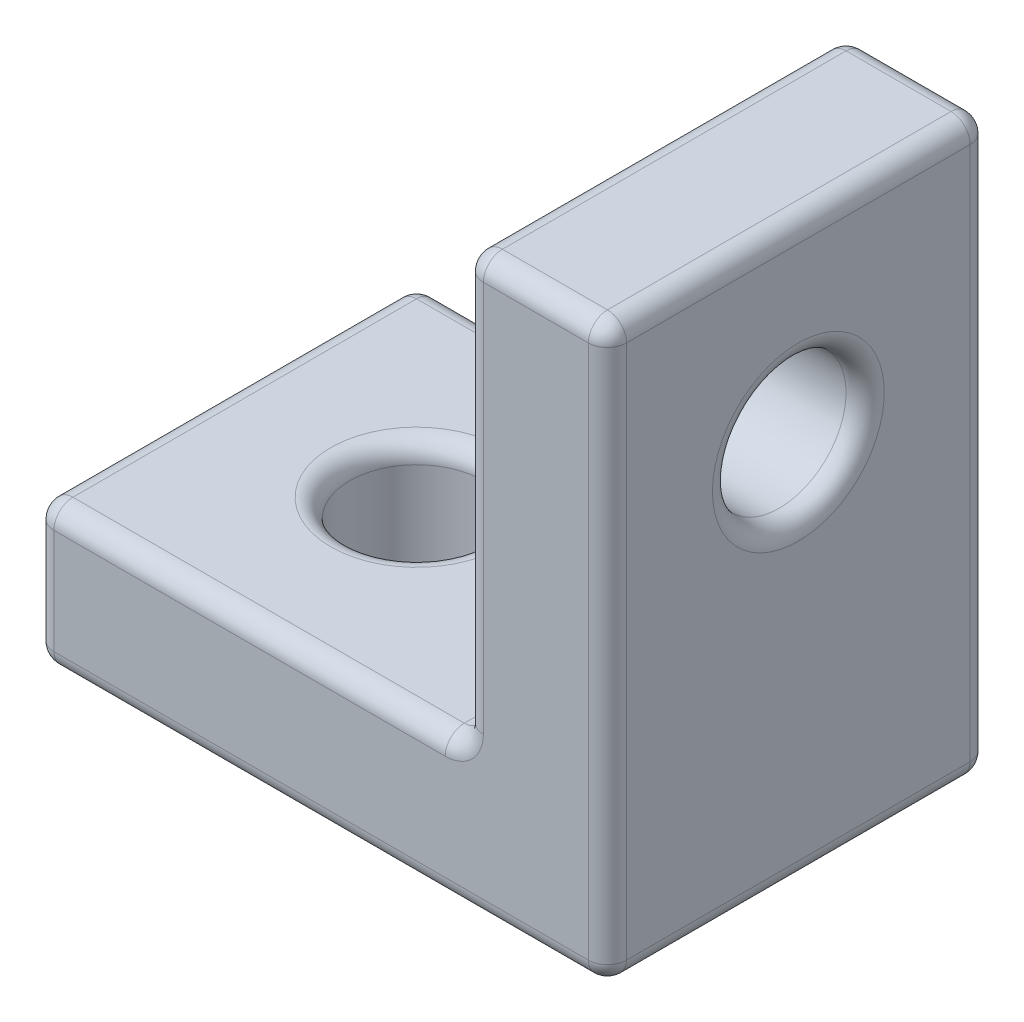
ISO-10303-21;
HEADER;
FILE_DESCRIPTION(('STEP AP214'),'2;1');
FILE_NAME('part.step','',(''),(''),'','','');
FILE_SCHEMA(('AUTOMOTIVE_DESIGN { 1 0 10303 214 1 1 1 1 }'));
ENDSEC;
DATA;
#1=APPLICATION_CONTEXT('core data for automotive mechanical design processes');
#2=APPLICATION_PROTOCOL_DEFINITION('international standard','automotive_design',2000,#1);
#3=PRODUCT_CONTEXT('',#1,'mechanical');
#4=PRODUCT('Part','Part','',(#3));
#5=PRODUCT_RELATED_PRODUCT_CATEGORY('part','',(#4));
#6=PRODUCT_DEFINITION_FORMATION('','',#4);
#7=PRODUCT_DEFINITION_CONTEXT('part definition',#1,'design');
#8=PRODUCT_DEFINITION('design','',#6,#7);
#9=PRODUCT_DEFINITION_SHAPE('','',#8);
#10=(LENGTH_UNIT() NAMED_UNIT(*) SI_UNIT(.MILLI.,.METRE.));
#11=(NAMED_UNIT(*) PLANE_ANGLE_UNIT() SI_UNIT($,.RADIAN.));
#12=(NAMED_UNIT(*) SI_UNIT($,.STERADIAN.) SOLID_ANGLE_UNIT());
#13=UNCERTAINTY_MEASURE_WITH_UNIT(LENGTH_MEASURE(1.E-05),#10,'distance_accuracy_value','');
#14=(GEOMETRIC_REPRESENTATION_CONTEXT(3) GLOBAL_UNCERTAINTY_ASSIGNED_CONTEXT((#13)) GLOBAL_UNIT_ASSIGNED_CONTEXT((#10,
#11,#12)) REPRESENTATION_CONTEXT('',''));
#15=CARTESIAN_POINT('',(0.,0.,0.));
#16=DIRECTION('',(0.,0.,1.));
#17=DIRECTION('',(1.,0.,0.));
#18=AXIS2_PLACEMENT_3D('',#15,#16,#17);
#19=CARTESIAN_POINT('',(0.,3.,0.));
#20=DIRECTION('',(0.,1.,0.));
#21=DIRECTION('',(0.,0.,1.));
#22=AXIS2_PLACEMENT_3D('',#19,#20,#21);
#23=PLANE('',#22);
#24=CARTESIAN_POINT('',(4.,3.,4.));
#25=DIRECTION('',(0.,1.,0.));
#26=DIRECTION('',(0.,0.,1.));
#27=AXIS2_PLACEMENT_3D('',#24,#25,#26);
#28=CIRCLE('',#27,1.8);
#29=CARTESIAN_POINT('',(4.,3.,5.8));
#30=VERTEX_POINT('',#29);
#31=EDGE_CURVE('E260',#30,#30,#28,.F.);
#32=ORIENTED_EDGE('',*,*,#31,.T.);
#33=EDGE_LOOP('',(#32));
#34=FACE_BOUND('',#33,.T.);
#35=DIRECTION('',(0.,0.,1.));
#36=VECTOR('',#35,1.);
#37=CARTESIAN_POINT('',(0.400000000000001,3.,8.));
#38=LINE('',#37,#36);
#39=CARTESIAN_POINT('',(0.4,3.,0.4));
#40=VERTEX_POINT('',#39);
#41=CARTESIAN_POINT('',(0.400000000000001,3.,7.6));
#42=VERTEX_POINT('',#41);
#43=EDGE_CURVE('E255',#40,#42,#38,.T.);
#44=ORIENTED_EDGE('',*,*,#43,.T.);
#45=DIRECTION('',(1.,0.,0.));
#46=VECTOR('',#45,1.);
#47=CARTESIAN_POINT('',(9.,3.,7.6));
#48=LINE('',#47,#46);
#49=CARTESIAN_POINT('',(8.6,3.,7.6));
#50=VERTEX_POINT('',#49);
#51=EDGE_CURVE('E257',#42,#50,#48,.T.);
#52=ORIENTED_EDGE('',*,*,#51,.T.);
#53=DIRECTION('',(0.,0.,1.));
#54=VECTOR('',#53,1.);
#55=CARTESIAN_POINT('',(8.6,3.,0.));
#56=LINE('',#55,#54);
#57=CARTESIAN_POINT('',(8.6,3.,0.4));
#58=VERTEX_POINT('',#57);
#59=EDGE_CURVE('E253',#50,#58,#56,.F.);
#60=ORIENTED_EDGE('',*,*,#59,.T.);
#61=DIRECTION('',(-1.,0.,0.));
#62=VECTOR('',#61,1.);
#63=CARTESIAN_POINT('',(0.,3.,0.4));
#64=LINE('',#63,#62);
#65=EDGE_CURVE('E251',#58,#40,#64,.T.);
#66=ORIENTED_EDGE('',*,*,#65,.T.);
#67=EDGE_LOOP('',(#44,#52,#60,#66));
#68=FACE_BOUND('',#67,.T.);
#69=ADVANCED_FACE('F32',(#34,#68),#23,.T.);
#70=CARTESIAN_POINT('',(0.,0.,0.));
#71=DIRECTION('',(0.,1.,0.));
#72=DIRECTION('',(0.,0.,1.));
#73=AXIS2_PLACEMENT_3D('',#70,#71,#72);
#74=PLANE('',#73);
#75=CARTESIAN_POINT('',(4.,0.,4.));
#76=DIRECTION('',(0.,1.,0.));
#77=DIRECTION('',(0.,0.,1.));
#78=AXIS2_PLACEMENT_3D('',#75,#76,#77);
#79=CIRCLE('',#78,1.8);
#80=CARTESIAN_POINT('',(4.,0.,5.8));
#81=VERTEX_POINT('',#80);
#82=EDGE_CURVE('E217',#81,#81,#79,.T.);
#83=ORIENTED_EDGE('',*,*,#82,.T.);
#84=EDGE_LOOP('',(#83));
#85=FACE_BOUND('',#84,.T.);
#86=DIRECTION('',(-1.,0.,0.));
#87=VECTOR('',#86,1.);
#88=CARTESIAN_POINT('',(0.,0.,0.4));
#89=LINE('',#88,#87);
#90=CARTESIAN_POINT('',(0.4,0.,0.4));
#91=VERTEX_POINT('',#90);
#92=CARTESIAN_POINT('',(11.6,0.,0.4));
#93=VERTEX_POINT('',#92);
#94=EDGE_CURVE('E210',#91,#93,#89,.F.);
#95=ORIENTED_EDGE('',*,*,#94,.T.);
#96=DIRECTION('',(0.,0.,-1.));
#97=VECTOR('',#96,1.);
#98=CARTESIAN_POINT('',(11.6,0.,0.));
#99=LINE('',#98,#97);
#100=CARTESIAN_POINT('',(11.6,0.,7.6));
#101=VERTEX_POINT('',#100);
#102=EDGE_CURVE('E169',#93,#101,#99,.F.);
#103=ORIENTED_EDGE('',*,*,#102,.T.);
#104=DIRECTION('',(1.,0.,0.));
#105=VECTOR('',#104,1.);
#106=CARTESIAN_POINT('',(0.,0.,7.6));
#107=LINE('',#106,#105);
#108=CARTESIAN_POINT('',(0.400000000000001,0.,7.6));
#109=VERTEX_POINT('',#108);
#110=EDGE_CURVE('E214',#101,#109,#107,.F.);
#111=ORIENTED_EDGE('',*,*,#110,.T.);
#112=DIRECTION('',(0.,0.,1.));
#113=VECTOR('',#112,1.);
#114=CARTESIAN_POINT('',(0.4,0.,0.));
#115=LINE('',#114,#113);
#116=EDGE_CURVE('E212',#109,#91,#115,.F.);
#117=ORIENTED_EDGE('',*,*,#116,.T.);
#118=EDGE_LOOP('',(#95,#103,#111,#117));
#119=FACE_BOUND('',#118,.T.);
#120=ADVANCED_FACE('F459',(#85,#119),#74,.F.);
#121=CARTESIAN_POINT('',(0.,3.,0.));
#122=DIRECTION('',(1.,0.,0.));
#123=DIRECTION('',(0.,0.,-1.));
#124=AXIS2_PLACEMENT_3D('',#121,#122,#123);
#125=PLANE('',#124);
#126=DIRECTION('',(0.,0.,1.));
#127=VECTOR('',#126,1.);
#128=CARTESIAN_POINT('',(0.,0.4,0.));
#129=LINE('',#128,#127);
#130=CARTESIAN_POINT('',(0.,0.4,0.4));
#131=VERTEX_POINT('',#130);
#132=CARTESIAN_POINT('',(0.,0.4,7.6));
#133=VERTEX_POINT('',#132);
#134=EDGE_CURVE('E246',#131,#133,#129,.T.);
#135=ORIENTED_EDGE('',*,*,#134,.T.);
#136=DIRECTION('',(0.,-1.,0.));
#137=VECTOR('',#136,1.);
#138=CARTESIAN_POINT('',(0.,3.,7.6));
#139=LINE('',#138,#137);
#140=CARTESIAN_POINT('',(0.,2.6,7.6));
#141=VERTEX_POINT('',#140);
#142=EDGE_CURVE('E248',#133,#141,#139,.F.);
#143=ORIENTED_EDGE('',*,*,#142,.T.);
#144=DIRECTION('',(0.,0.,1.));
#145=VECTOR('',#144,1.);
#146=CARTESIAN_POINT('',(0.,2.6,0.));
#147=LINE('',#146,#145);
#148=CARTESIAN_POINT('',(0.,2.6,0.4));
#149=VERTEX_POINT('',#148);
#150=EDGE_CURVE('E244',#141,#149,#147,.F.);
#151=ORIENTED_EDGE('',*,*,#150,.T.);
#152=DIRECTION('',(0.,-1.,0.));
#153=VECTOR('',#152,1.);
#154=CARTESIAN_POINT('',(0.,3.,0.4));
#155=LINE('',#154,#153);
#156=EDGE_CURVE('E242',#149,#131,#155,.T.);
#157=ORIENTED_EDGE('',*,*,#156,.T.);
#158=EDGE_LOOP('',(#135,#143,#151,#157));
#159=FACE_BOUND('',#158,.T.);
#160=ADVANCED_FACE('F467',(#159),#125,.F.);
#161=CARTESIAN_POINT('',(0.,3.,8.));
#162=DIRECTION('',(0.,0.,-1.));
#163=DIRECTION('',(-1.,0.,0.));
#164=AXIS2_PLACEMENT_3D('',#161,#162,#163);
#165=PLANE('',#164);
#166=DIRECTION('',(0.,-1.,0.));
#167=VECTOR('',#166,1.);
#168=CARTESIAN_POINT('',(0.400000000000001,3.,8.));
#169=LINE('',#168,#167);
#170=CARTESIAN_POINT('',(0.400000000000001,2.6,8.));
#171=VERTEX_POINT('',#170);
#172=CARTESIAN_POINT('',(0.400000000000001,0.4,8.));
#173=VERTEX_POINT('',#172);
#174=EDGE_CURVE('E238',#171,#173,#169,.T.);
#175=ORIENTED_EDGE('',*,*,#174,.T.);
#176=DIRECTION('',(1.,0.,0.));
#177=VECTOR('',#176,1.);
#178=CARTESIAN_POINT('',(0.,0.4,8.));
#179=LINE('',#178,#177);
#180=CARTESIAN_POINT('',(11.6,0.4,8.));
#181=VERTEX_POINT('',#180);
#182=EDGE_CURVE('E240',#173,#181,#179,.T.);
#183=ORIENTED_EDGE('',*,*,#182,.T.);
#184=DIRECTION('',(0.,-1.,0.));
#185=VECTOR('',#184,1.);
#186=CARTESIAN_POINT('',(11.6,3.,8.));
#187=LINE('',#186,#185);
#188=CARTESIAN_POINT('',(11.6,11.6,8.));
#189=VERTEX_POINT('',#188);
#190=EDGE_CURVE('E230',#181,#189,#187,.F.);
#191=ORIENTED_EDGE('',*,*,#190,.T.);
#192=DIRECTION('',(1.,0.,0.));
#193=VECTOR('',#192,1.);
#194=CARTESIAN_POINT('',(0.,11.6,8.));
#195=LINE('',#194,#193);
#196=CARTESIAN_POINT('',(9.4,11.6,8.));
#197=VERTEX_POINT('',#196);
#198=EDGE_CURVE('E226',#189,#197,#195,.F.);
#199=ORIENTED_EDGE('',*,*,#198,.T.);
#200=DIRECTION('',(0.,-1.,0.));
#201=VECTOR('',#200,1.);
#202=CARTESIAN_POINT('',(9.4,3.,8.));
#203=LINE('',#202,#201);
#204=CARTESIAN_POINT('',(9.4,3.4,8.));
#205=VERTEX_POINT('',#204);
#206=EDGE_CURVE('E228',#197,#205,#203,.T.);
#207=ORIENTED_EDGE('',*,*,#206,.T.);
#208=CARTESIAN_POINT('',(8.6,3.4,8.));
#209=DIRECTION('',(0.,0.,-1.));
#210=DIRECTION('',(-1.,0.,0.));
#211=AXIS2_PLACEMENT_3D('',#208,#209,#210);
#212=CIRCLE('',#211,0.8);
#213=CARTESIAN_POINT('',(8.6,2.6,8.));
#214=VERTEX_POINT('',#213);
#215=EDGE_CURVE('E233',#214,#205,#212,.F.);
#216=ORIENTED_EDGE('',*,*,#215,.F.);
#217=DIRECTION('',(1.,0.,0.));
#218=VECTOR('',#217,1.);
#219=CARTESIAN_POINT('',(0.,2.6,8.));
#220=LINE('',#219,#218);
#221=EDGE_CURVE('E236',#214,#171,#220,.F.);
#222=ORIENTED_EDGE('',*,*,#221,.T.);
#223=EDGE_LOOP('',(#175,#183,#191,#199,#207,#216,#222));
#224=FACE_BOUND('',#223,.T.);
#225=ADVANCED_FACE('F417',(#224),#165,.F.);
#226=CARTESIAN_POINT('',(12.,3.,0.));
#227=DIRECTION('',(-1.,0.,0.));
#228=DIRECTION('',(0.,0.,1.));
#229=AXIS2_PLACEMENT_3D('',#226,#227,#228);
#230=PLANE('',#229);
#231=CARTESIAN_POINT('',(12.,8.,4.));
#232=DIRECTION('',(-1.,0.,0.));
#233=DIRECTION('',(0.,0.,1.));
#234=AXIS2_PLACEMENT_3D('',#231,#232,#233);
#235=CIRCLE('',#234,1.8);
#236=CARTESIAN_POINT('',(12.,8.,5.8));
#237=VERTEX_POINT('',#236);
#238=EDGE_CURVE('E197',#237,#237,#235,.T.);
#239=ORIENTED_EDGE('',*,*,#238,.T.);
#240=EDGE_LOOP('',(#239));
#241=FACE_BOUND('',#240,.T.);
#242=DIRECTION('',(0.,-1.,0.));
#243=VECTOR('',#242,1.);
#244=CARTESIAN_POINT('',(12.,3.,7.6));
#245=LINE('',#244,#243);
#246=CARTESIAN_POINT('',(12.,11.6,7.6));
#247=VERTEX_POINT('',#246);
#248=CARTESIAN_POINT('',(12.,0.4,7.6));
#249=VERTEX_POINT('',#248);
#250=EDGE_CURVE('E195',#247,#249,#245,.T.);
#251=ORIENTED_EDGE('',*,*,#250,.T.);
#252=DIRECTION('',(0.,0.,-1.));
#253=VECTOR('',#252,1.);
#254=CARTESIAN_POINT('',(12.,0.4,0.));
#255=LINE('',#254,#253);
#256=CARTESIAN_POINT('',(12.,0.4,0.4));
#257=VERTEX_POINT('',#256);
#258=EDGE_CURVE('E167',#249,#257,#255,.T.);
#259=ORIENTED_EDGE('',*,*,#258,.T.);
#260=DIRECTION('',(0.,-1.,0.));
#261=VECTOR('',#260,1.);
#262=CARTESIAN_POINT('',(12.,3.,0.4));
#263=LINE('',#262,#261);
#264=CARTESIAN_POINT('',(12.,11.6,0.4));
#265=VERTEX_POINT('',#264);
#266=EDGE_CURVE('E185',#257,#265,#263,.F.);
#267=ORIENTED_EDGE('',*,*,#266,.T.);
#268=DIRECTION('',(0.,0.,-1.));
#269=VECTOR('',#268,1.);
#270=CARTESIAN_POINT('',(12.,11.6,0.));
#271=LINE('',#270,#269);
#272=EDGE_CURVE('E191',#265,#247,#271,.F.);
#273=ORIENTED_EDGE('',*,*,#272,.T.);
#274=EDGE_LOOP('',(#251,#259,#267,#273));
#275=FACE_BOUND('',#274,.T.);
#276=ADVANCED_FACE('F193',(#241,#275),#230,.F.);
#277=CARTESIAN_POINT('',(0.,3.,0.));
#278=DIRECTION('',(0.,0.,1.));
#279=DIRECTION('',(1.,0.,0.));
#280=AXIS2_PLACEMENT_3D('',#277,#278,#279);
#281=PLANE('',#280);
#282=DIRECTION('',(0.,-1.,0.));
#283=VECTOR('',#282,1.);
#284=CARTESIAN_POINT('',(9.4,3.,0.));
#285=LINE('',#284,#283);
#286=CARTESIAN_POINT('',(9.4,3.4,0.));
#287=VERTEX_POINT('',#286);
#288=CARTESIAN_POINT('',(9.4,11.6,0.));
#289=VERTEX_POINT('',#288);
#290=EDGE_CURVE('E41',#287,#289,#285,.F.);
#291=ORIENTED_EDGE('',*,*,#290,.T.);
#292=DIRECTION('',(-1.,0.,0.));
#293=VECTOR('',#292,1.);
#294=CARTESIAN_POINT('',(0.,11.6,0.));
#295=LINE('',#294,#293);
#296=CARTESIAN_POINT('',(11.6,11.6,0.));
#297=VERTEX_POINT('',#296);
#298=EDGE_CURVE('E11',#289,#297,#295,.F.);
#299=ORIENTED_EDGE('',*,*,#298,.T.);
#300=DIRECTION('',(0.,-1.,0.));
#301=VECTOR('',#300,1.);
#302=CARTESIAN_POINT('',(11.6,3.,0.));
#303=LINE('',#302,#301);
#304=CARTESIAN_POINT('',(11.6,0.4,0.));
#305=VERTEX_POINT('',#304);
#306=EDGE_CURVE('E290',#297,#305,#303,.T.);
#307=ORIENTED_EDGE('',*,*,#306,.T.);
#308=DIRECTION('',(-1.,0.,0.));
#309=VECTOR('',#308,1.);
#310=CARTESIAN_POINT('',(0.,0.4,0.));
#311=LINE('',#310,#309);
#312=CARTESIAN_POINT('',(0.4,0.4,0.));
#313=VERTEX_POINT('',#312);
#314=EDGE_CURVE('E284',#305,#313,#311,.T.);
#315=ORIENTED_EDGE('',*,*,#314,.T.);
#316=DIRECTION('',(0.,-1.,0.));
#317=VECTOR('',#316,1.);
#318=CARTESIAN_POINT('',(0.4,3.,0.));
#319=LINE('',#318,#317);
#320=CARTESIAN_POINT('',(0.4,2.6,0.));
#321=VERTEX_POINT('',#320);
#322=EDGE_CURVE('E286',#313,#321,#319,.F.);
#323=ORIENTED_EDGE('',*,*,#322,.T.);
#324=DIRECTION('',(-1.,0.,0.));
#325=VECTOR('',#324,1.);
#326=CARTESIAN_POINT('',(9.,2.6,0.));
#327=LINE('',#326,#325);
#328=CARTESIAN_POINT('',(8.6,2.6,0.));
#329=VERTEX_POINT('',#328);
#330=EDGE_CURVE('E288',#321,#329,#327,.F.);
#331=ORIENTED_EDGE('',*,*,#330,.T.);
#332=CARTESIAN_POINT('',(8.6,3.4,0.));
#333=DIRECTION('',(0.,0.,1.));
#334=DIRECTION('',(1.,0.,0.));
#335=AXIS2_PLACEMENT_3D('',#332,#333,#334);
#336=CIRCLE('',#335,0.8);
#337=EDGE_CURVE('E52',#287,#329,#336,.F.);
#338=ORIENTED_EDGE('',*,*,#337,.F.);
#339=EDGE_LOOP('',(#291,#299,#307,#315,#323,#331,#338));
#340=FACE_BOUND('',#339,.T.);
#341=ADVANCED_FACE('F443',(#340),#281,.F.);
#342=CARTESIAN_POINT('',(4.,3.,4.));
#343=DIRECTION('',(0.,-1.,0.));
#344=DIRECTION('',(0.,0.,-1.));
#345=AXIS2_PLACEMENT_3D('',#342,#343,#344);
#346=CYLINDRICAL_SURFACE('',#345,1.4);
#347=CARTESIAN_POINT('',(4.,0.4,4.));
#348=DIRECTION('',(0.,1.,0.));
#349=DIRECTION('',(0.,0.,1.));
#350=AXIS2_PLACEMENT_3D('',#347,#348,#349);
#351=CIRCLE('',#350,1.4);
#352=CARTESIAN_POINT('',(4.,0.4,5.4));
#353=VERTEX_POINT('',#352);
#354=EDGE_CURVE('E223',#353,#353,#351,.F.);
#355=ORIENTED_EDGE('',*,*,#354,.T.);
#356=EDGE_LOOP('',(#355));
#357=FACE_BOUND('',#356,.T.);
#358=CARTESIAN_POINT('',(4.,2.6,4.));
#359=DIRECTION('',(0.,1.,0.));
#360=DIRECTION('',(0.,0.,1.));
#361=AXIS2_PLACEMENT_3D('',#358,#359,#360);
#362=CIRCLE('',#361,1.4);
#363=CARTESIAN_POINT('',(4.,2.6,5.4));
#364=VERTEX_POINT('',#363);
#365=EDGE_CURVE('E220',#364,#364,#362,.T.);
#366=ORIENTED_EDGE('',*,*,#365,.T.);
#367=EDGE_LOOP('',(#366));
#368=FACE_BOUND('',#367,.T.);
#369=ADVANCED_FACE('F491',(#357,#368),#346,.F.);
#370=CARTESIAN_POINT('',(9.,12.,0.));
#371=DIRECTION('',(1.,0.,0.));
#372=DIRECTION('',(0.,0.,-1.));
#373=AXIS2_PLACEMENT_3D('',#370,#371,#372);
#374=PLANE('',#373);
#375=CARTESIAN_POINT('',(9.,8.,4.));
#376=DIRECTION('',(1.,0.,0.));
#377=DIRECTION('',(0.,0.,-1.));
#378=AXIS2_PLACEMENT_3D('',#375,#376,#377);
#379=CIRCLE('',#378,1.8);
#380=CARTESIAN_POINT('',(9.,8.,2.2));
#381=VERTEX_POINT('',#380);
#382=EDGE_CURVE('E272',#381,#381,#379,.T.);
#383=ORIENTED_EDGE('',*,*,#382,.T.);
#384=EDGE_LOOP('',(#383));
#385=FACE_BOUND('',#384,.T.);
#386=DIRECTION('',(0.,0.,1.));
#387=VECTOR('',#386,1.);
#388=CARTESIAN_POINT('',(9.,3.4,0.));
#389=LINE('',#388,#387);
#390=CARTESIAN_POINT('',(9.,3.4,0.4));
#391=VERTEX_POINT('',#390);
#392=CARTESIAN_POINT('',(9.,3.4,7.6));
#393=VERTEX_POINT('',#392);
#394=EDGE_CURVE('E267',#391,#393,#389,.T.);
#395=ORIENTED_EDGE('',*,*,#394,.T.);
#396=DIRECTION('',(0.,-1.,0.));
#397=VECTOR('',#396,1.);
#398=CARTESIAN_POINT('',(9.,12.,7.6));
#399=LINE('',#398,#397);
#400=CARTESIAN_POINT('',(9.,11.6,7.6));
#401=VERTEX_POINT('',#400);
#402=EDGE_CURVE('E269',#393,#401,#399,.F.);
#403=ORIENTED_EDGE('',*,*,#402,.T.);
#404=DIRECTION('',(0.,0.,1.));
#405=VECTOR('',#404,1.);
#406=CARTESIAN_POINT('',(9.,11.6,0.));
#407=LINE('',#406,#405);
#408=CARTESIAN_POINT('',(9.,11.6,0.4));
#409=VERTEX_POINT('',#408);
#410=EDGE_CURVE('E265',#401,#409,#407,.F.);
#411=ORIENTED_EDGE('',*,*,#410,.T.);
#412=DIRECTION('',(0.,-1.,0.));
#413=VECTOR('',#412,1.);
#414=CARTESIAN_POINT('',(9.,12.,0.4));
#415=LINE('',#414,#413);
#416=EDGE_CURVE('E263',#409,#391,#415,.T.);
#417=ORIENTED_EDGE('',*,*,#416,.T.);
#418=EDGE_LOOP('',(#395,#403,#411,#417));
#419=FACE_BOUND('',#418,.T.);
#420=ADVANCED_FACE('F426',(#385,#419),#374,.F.);
#421=CARTESIAN_POINT('',(0.,12.,0.));
#422=DIRECTION('',(0.,-1.,0.));
#423=DIRECTION('',(0.,0.,-1.));
#424=AXIS2_PLACEMENT_3D('',#421,#422,#423);
#425=PLANE('',#424);
#426=DIRECTION('',(0.,0.,1.));
#427=VECTOR('',#426,1.);
#428=CARTESIAN_POINT('',(9.4,12.,0.));
#429=LINE('',#428,#427);
#430=CARTESIAN_POINT('',(9.4,12.,0.4));
#431=VERTEX_POINT('',#430);
#432=CARTESIAN_POINT('',(9.4,12.,7.6));
#433=VERTEX_POINT('',#432);
#434=EDGE_CURVE('E279',#431,#433,#429,.T.);
#435=ORIENTED_EDGE('',*,*,#434,.T.);
#436=DIRECTION('',(1.,0.,0.));
#437=VECTOR('',#436,1.);
#438=CARTESIAN_POINT('',(0.,12.,7.6));
#439=LINE('',#438,#437);
#440=CARTESIAN_POINT('',(11.6,12.,7.6));
#441=VERTEX_POINT('',#440);
#442=EDGE_CURVE('E281',#433,#441,#439,.T.);
#443=ORIENTED_EDGE('',*,*,#442,.T.);
#444=DIRECTION('',(0.,0.,-1.));
#445=VECTOR('',#444,1.);
#446=CARTESIAN_POINT('',(11.6,12.,0.));
#447=LINE('',#446,#445);
#448=CARTESIAN_POINT('',(11.6,12.,0.4));
#449=VERTEX_POINT('',#448);
#450=EDGE_CURVE('E277',#441,#449,#447,.T.);
#451=ORIENTED_EDGE('',*,*,#450,.T.);
#452=DIRECTION('',(-1.,0.,0.));
#453=VECTOR('',#452,1.);
#454=CARTESIAN_POINT('',(0.,12.,0.4));
#455=LINE('',#454,#453);
#456=EDGE_CURVE('E275',#449,#431,#455,.T.);
#457=ORIENTED_EDGE('',*,*,#456,.T.);
#458=EDGE_LOOP('',(#435,#443,#451,#457));
#459=FACE_BOUND('',#458,.T.);
#460=ADVANCED_FACE('F792',(#459),#425,.F.);
#461=CARTESIAN_POINT('',(19.,8.,4.));
#462=DIRECTION('',(-1.,0.,0.));
#463=DIRECTION('',(0.,0.,1.));
#464=AXIS2_PLACEMENT_3D('',#461,#462,#463);
#465=CYLINDRICAL_SURFACE('',#464,1.4);
#466=CARTESIAN_POINT('',(11.6,8.,4.));
#467=DIRECTION('',(-1.,0.,0.));
#468=DIRECTION('',(0.,0.,1.));
#469=AXIS2_PLACEMENT_3D('',#466,#467,#468);
#470=CIRCLE('',#469,1.4);
#471=CARTESIAN_POINT('',(11.6,8.,5.4));
#472=VERTEX_POINT('',#471);
#473=EDGE_CURVE('E207',#472,#472,#470,.F.);
#474=ORIENTED_EDGE('',*,*,#473,.T.);
#475=EDGE_LOOP('',(#474));
#476=FACE_BOUND('',#475,.T.);
#477=CARTESIAN_POINT('',(9.4,8.,4.));
#478=DIRECTION('',(1.,0.,0.));
#479=DIRECTION('',(0.,0.,-1.));
#480=AXIS2_PLACEMENT_3D('',#477,#478,#479);
#481=CIRCLE('',#480,1.4);
#482=CARTESIAN_POINT('',(9.4,8.,2.6));
#483=VERTEX_POINT('',#482);
#484=EDGE_CURVE('E200',#483,#483,#481,.F.);
#485=ORIENTED_EDGE('',*,*,#484,.T.);
#486=EDGE_LOOP('',(#485));
#487=FACE_BOUND('',#486,.T.);
#488=ADVANCED_FACE('F507',(#476,#487),#465,.F.);
#489=CARTESIAN_POINT('',(11.6,8.,4.));
#490=DIRECTION('',(-1.,0.,0.));
#491=DIRECTION('',(0.,0.,1.));
#492=AXIS2_PLACEMENT_3D('',#489,#490,#491);
#493=TOROIDAL_SURFACE('',#492,1.8,0.4);
#494=ORIENTED_EDGE('',*,*,#473,.F.);
#495=EDGE_LOOP('',(#494));
#496=FACE_BOUND('',#495,.T.);
#497=ORIENTED_EDGE('',*,*,#238,.F.);
#498=EDGE_LOOP('',(#497));
#499=FACE_BOUND('',#498,.T.);
#500=ADVANCED_FACE('F503',(#496,#499),#493,.T.);
#501=CARTESIAN_POINT('',(4.,0.4,4.));
#502=DIRECTION('',(0.,1.,0.));
#503=DIRECTION('',(0.,0.,1.));
#504=AXIS2_PLACEMENT_3D('',#501,#502,#503);
#505=TOROIDAL_SURFACE('',#504,1.8,0.4);
#506=ORIENTED_EDGE('',*,*,#354,.F.);
#507=EDGE_LOOP('',(#506));
#508=FACE_BOUND('',#507,.T.);
#509=ORIENTED_EDGE('',*,*,#82,.F.);
#510=EDGE_LOOP('',(#509));
#511=FACE_BOUND('',#510,.T.);
#512=ADVANCED_FACE('F506',(#508,#511),#505,.T.);
#513=CARTESIAN_POINT('',(8.6,3.4,0.));
#514=DIRECTION('',(0.,0.,1.));
#515=DIRECTION('',(1.,0.,0.));
#516=AXIS2_PLACEMENT_3D('',#513,#514,#515);
#517=CYLINDRICAL_SURFACE('',#516,0.4);
#518=CARTESIAN_POINT('',(8.6,3.4,7.6));
#519=DIRECTION('',(0.,0.,-1.));
#520=DIRECTION('',(-1.,0.,0.));
#521=AXIS2_PLACEMENT_3D('',#518,#519,#520);
#522=CIRCLE('',#521,0.4);
#523=EDGE_CURVE('E36',#393,#50,#522,.T.);
#524=ORIENTED_EDGE('',*,*,#523,.F.);
#525=ORIENTED_EDGE('',*,*,#394,.F.);
#526=CARTESIAN_POINT('',(8.6,3.4,0.4));
#527=DIRECTION('',(0.,0.,1.));
#528=DIRECTION('',(1.,0.,0.));
#529=AXIS2_PLACEMENT_3D('',#526,#527,#528);
#530=CIRCLE('',#529,0.4);
#531=EDGE_CURVE('E378',#58,#391,#530,.T.);
#532=ORIENTED_EDGE('',*,*,#531,.F.);
#533=ORIENTED_EDGE('',*,*,#59,.F.);
#534=EDGE_LOOP('',(#524,#525,#532,#533));
#535=FACE_BOUND('',#534,.T.);
#536=ADVANCED_FACE('F394',(#535),#517,.F.);
#537=CARTESIAN_POINT('',(8.6,3.4,7.6));
#538=DIRECTION('',(0.,0.,-1.));
#539=DIRECTION('',(-1.,0.,0.));
#540=AXIS2_PLACEMENT_3D('',#537,#538,#539);
#541=TOROIDAL_SURFACE('',#540,0.8,0.4);
#542=CARTESIAN_POINT('',(9.4,3.4,7.6));
#543=DIRECTION('',(0.,-1.,0.));
#544=DIRECTION('',(0.,0.,-1.));
#545=AXIS2_PLACEMENT_3D('',#542,#543,#544);
#546=CIRCLE('',#545,0.4);
#547=EDGE_CURVE('E374',#393,#205,#546,.F.);
#548=ORIENTED_EDGE('',*,*,#547,.F.);
#549=ORIENTED_EDGE('',*,*,#523,.T.);
#550=CARTESIAN_POINT('',(8.6,2.6,7.6));
#551=DIRECTION('',(1.,0.,0.));
#552=DIRECTION('',(0.,0.,-1.));
#553=AXIS2_PLACEMENT_3D('',#550,#551,#552);
#554=CIRCLE('',#553,0.4);
#555=EDGE_CURVE('E377',#214,#50,#554,.F.);
#556=ORIENTED_EDGE('',*,*,#555,.F.);
#557=ORIENTED_EDGE('',*,*,#215,.T.);
#558=EDGE_LOOP('',(#548,#549,#556,#557));
#559=FACE_BOUND('',#558,.T.);
#560=ADVANCED_FACE('F389',(#559),#541,.T.);
#561=CARTESIAN_POINT('',(8.6,3.4,0.4));
#562=DIRECTION('',(0.,0.,1.));
#563=DIRECTION('',(1.,0.,0.));
#564=AXIS2_PLACEMENT_3D('',#561,#562,#563);
#565=TOROIDAL_SURFACE('',#564,0.8,0.4);
#566=CARTESIAN_POINT('',(8.6,2.6,0.4));
#567=DIRECTION('',(1.,0.,0.));
#568=DIRECTION('',(0.,0.,-1.));
#569=AXIS2_PLACEMENT_3D('',#566,#567,#568);
#570=CIRCLE('',#569,0.4);
#571=EDGE_CURVE('E368',#58,#329,#570,.F.);
#572=ORIENTED_EDGE('',*,*,#571,.F.);
#573=ORIENTED_EDGE('',*,*,#531,.T.);
#574=CARTESIAN_POINT('',(9.4,3.4,0.4));
#575=DIRECTION('',(0.,-1.,0.));
#576=DIRECTION('',(0.,0.,-1.));
#577=AXIS2_PLACEMENT_3D('',#574,#575,#576);
#578=CIRCLE('',#577,0.4);
#579=EDGE_CURVE('E371',#287,#391,#578,.F.);
#580=ORIENTED_EDGE('',*,*,#579,.F.);
#581=ORIENTED_EDGE('',*,*,#337,.T.);
#582=EDGE_LOOP('',(#572,#573,#580,#581));
#583=FACE_BOUND('',#582,.T.);
#584=ADVANCED_FACE('F473',(#583),#565,.T.);
#585=CARTESIAN_POINT('',(0.,2.6,7.6));
#586=DIRECTION('',(-1.,0.,0.));
#587=DIRECTION('',(0.,0.,1.));
#588=AXIS2_PLACEMENT_3D('',#585,#586,#587);
#589=CYLINDRICAL_SURFACE('',#588,0.4);
#590=ORIENTED_EDGE('',*,*,#555,.T.);
#591=ORIENTED_EDGE('',*,*,#51,.F.);
#592=CARTESIAN_POINT('',(0.400000000000001,2.6,7.6));
#593=DIRECTION('',(-1.,0.,0.));
#594=DIRECTION('',(0.,0.,1.));
#595=AXIS2_PLACEMENT_3D('',#592,#593,#594);
#596=CIRCLE('',#595,0.4);
#597=EDGE_CURVE('E362',#171,#42,#596,.T.);
#598=ORIENTED_EDGE('',*,*,#597,.F.);
#599=ORIENTED_EDGE('',*,*,#221,.F.);
#600=EDGE_LOOP('',(#590,#591,#598,#599));
#601=FACE_BOUND('',#600,.T.);
#602=ADVANCED_FACE('F401',(#601),#589,.T.);
#603=CARTESIAN_POINT('',(9.4,3.,7.6));
#604=DIRECTION('',(0.,-1.,0.));
#605=DIRECTION('',(0.,0.,-1.));
#606=AXIS2_PLACEMENT_3D('',#603,#604,#605);
#607=CYLINDRICAL_SURFACE('',#606,0.4);
#608=ORIENTED_EDGE('',*,*,#547,.T.);
#609=ORIENTED_EDGE('',*,*,#206,.F.);
#610=CARTESIAN_POINT('',(9.4,11.6,7.6));
#611=DIRECTION('',(0.,1.,0.));
#612=DIRECTION('',(0.,0.,1.));
#613=AXIS2_PLACEMENT_3D('',#610,#611,#612);
#614=CIRCLE('',#613,0.4);
#615=EDGE_CURVE('E359',#401,#197,#614,.T.);
#616=ORIENTED_EDGE('',*,*,#615,.F.);
#617=ORIENTED_EDGE('',*,*,#402,.F.);
#618=EDGE_LOOP('',(#608,#609,#616,#617));
#619=FACE_BOUND('',#618,.T.);
#620=ADVANCED_FACE('F422',(#619),#607,.T.);
#621=CARTESIAN_POINT('',(9.4,11.6,0.));
#622=DIRECTION('',(0.,0.,1.));
#623=DIRECTION('',(1.,0.,0.));
#624=AXIS2_PLACEMENT_3D('',#621,#622,#623);
#625=CYLINDRICAL_SURFACE('',#624,0.4);
#626=CARTESIAN_POINT('',(9.4,11.6,0.4));
#627=DIRECTION('',(0.,0.,-1.));
#628=DIRECTION('',(-1.,0.,0.));
#629=AXIS2_PLACEMENT_3D('',#626,#627,#628);
#630=CIRCLE('',#629,0.4);
#631=EDGE_CURVE('E354',#409,#431,#630,.T.);
#632=ORIENTED_EDGE('',*,*,#631,.F.);
#633=ORIENTED_EDGE('',*,*,#410,.F.);
#634=CARTESIAN_POINT('',(9.4,11.6,7.6));
#635=DIRECTION('',(0.,0.,1.));
#636=DIRECTION('',(1.,0.,0.));
#637=AXIS2_PLACEMENT_3D('',#634,#635,#636);
#638=CIRCLE('',#637,0.4);
#639=EDGE_CURVE('E357',#433,#401,#638,.T.);
#640=ORIENTED_EDGE('',*,*,#639,.F.);
#641=ORIENTED_EDGE('',*,*,#434,.F.);
#642=EDGE_LOOP('',(#632,#633,#640,#641));
#643=FACE_BOUND('',#642,.T.);
#644=ADVANCED_FACE('F434',(#643),#625,.T.);
#645=CARTESIAN_POINT('',(9.4,12.,0.4));
#646=DIRECTION('',(0.,-1.,0.));
#647=DIRECTION('',(0.,0.,-1.));
#648=AXIS2_PLACEMENT_3D('',#645,#646,#647);
#649=CYLINDRICAL_SURFACE('',#648,0.4);
#650=ORIENTED_EDGE('',*,*,#579,.T.);
#651=ORIENTED_EDGE('',*,*,#416,.F.);
#652=CARTESIAN_POINT('',(9.4,11.6,0.4));
#653=DIRECTION('',(0.,1.,0.));
#654=DIRECTION('',(0.,0.,1.));
#655=AXIS2_PLACEMENT_3D('',#652,#653,#654);
#656=CIRCLE('',#655,0.4);
#657=EDGE_CURVE('E351',#289,#409,#656,.T.);
#658=ORIENTED_EDGE('',*,*,#657,.F.);
#659=ORIENTED_EDGE('',*,*,#290,.F.);
#660=EDGE_LOOP('',(#650,#651,#658,#659));
#661=FACE_BOUND('',#660,.T.);
#662=ADVANCED_FACE('F430',(#661),#649,.T.);
#663=CARTESIAN_POINT('',(0.,2.6,0.4));
#664=DIRECTION('',(1.,0.,0.));
#665=DIRECTION('',(0.,0.,-1.));
#666=AXIS2_PLACEMENT_3D('',#663,#664,#665);
#667=CYLINDRICAL_SURFACE('',#666,0.4);
#668=ORIENTED_EDGE('',*,*,#571,.T.);
#669=ORIENTED_EDGE('',*,*,#330,.F.);
#670=CARTESIAN_POINT('',(0.4,2.6,0.4));
#671=DIRECTION('',(-1.,0.,0.));
#672=DIRECTION('',(0.,0.,1.));
#673=AXIS2_PLACEMENT_3D('',#670,#671,#672);
#674=CIRCLE('',#673,0.4);
#675=EDGE_CURVE('E348',#40,#321,#674,.T.);
#676=ORIENTED_EDGE('',*,*,#675,.F.);
#677=ORIENTED_EDGE('',*,*,#65,.F.);
#678=EDGE_LOOP('',(#668,#669,#676,#677));
#679=FACE_BOUND('',#678,.T.);
#680=ADVANCED_FACE('F472',(#679),#667,.T.);
#681=CARTESIAN_POINT('',(0.4,2.6,0.));
#682=DIRECTION('',(0.,0.,-1.));
#683=DIRECTION('',(-1.,0.,0.));
#684=AXIS2_PLACEMENT_3D('',#681,#682,#683);
#685=CYLINDRICAL_SURFACE('',#684,0.4);
#686=CARTESIAN_POINT('',(0.400000000000001,2.6,7.6));
#687=DIRECTION('',(0.,0.,1.));
#688=DIRECTION('',(1.,0.,0.));
#689=AXIS2_PLACEMENT_3D('',#686,#687,#688);
#690=CIRCLE('',#689,0.4);
#691=EDGE_CURVE('E365',#42,#141,#690,.T.);
#692=ORIENTED_EDGE('',*,*,#691,.F.);
#693=ORIENTED_EDGE('',*,*,#43,.F.);
#694=CARTESIAN_POINT('',(0.4,2.6,0.4));
#695=DIRECTION('',(0.,0.,-1.));
#696=DIRECTION('',(-1.,0.,0.));
#697=AXIS2_PLACEMENT_3D('',#694,#695,#696);
#698=CIRCLE('',#697,0.4);
#699=EDGE_CURVE('E345',#149,#40,#698,.T.);
#700=ORIENTED_EDGE('',*,*,#699,.F.);
#701=ORIENTED_EDGE('',*,*,#150,.F.);
#702=EDGE_LOOP('',(#692,#693,#700,#701));
#703=FACE_BOUND('',#702,.T.);
#704=ADVANCED_FACE('F405',(#703),#685,.T.);
#705=CARTESIAN_POINT('',(0.400000000000001,2.6,7.6));
#706=DIRECTION('',(0.,1.,0.));
#707=DIRECTION('',(0.,0.,1.));
#708=AXIS2_PLACEMENT_3D('',#705,#706,#707);
#709=SPHERICAL_SURFACE('',#708,0.4);
#710=ORIENTED_EDGE('',*,*,#597,.T.);
#711=ORIENTED_EDGE('',*,*,#691,.T.);
#712=CARTESIAN_POINT('',(0.400000000000001,2.6,7.6));
#713=DIRECTION('',(0.,1.,0.));
#714=DIRECTION('',(0.,0.,1.));
#715=AXIS2_PLACEMENT_3D('',#712,#713,#714);
#716=CIRCLE('',#715,0.4);
#717=EDGE_CURVE('E343',#171,#141,#716,.F.);
#718=ORIENTED_EDGE('',*,*,#717,.F.);
#719=EDGE_LOOP('',(#710,#711,#718));
#720=FACE_BOUND('',#719,.T.);
#721=ADVANCED_FACE('F409',(#720),#709,.T.);
#722=CARTESIAN_POINT('',(9.4,11.6,7.6));
#723=DIRECTION('',(-1.,0.,0.));
#724=DIRECTION('',(0.,0.,1.));
#725=AXIS2_PLACEMENT_3D('',#722,#723,#724);
#726=SPHERICAL_SURFACE('',#725,0.4);
#727=ORIENTED_EDGE('',*,*,#639,.T.);
#728=ORIENTED_EDGE('',*,*,#615,.T.);
#729=CARTESIAN_POINT('',(9.4,11.6,7.6));
#730=DIRECTION('',(-1.,0.,0.));
#731=DIRECTION('',(0.,0.,1.));
#732=AXIS2_PLACEMENT_3D('',#729,#730,#731);
#733=CIRCLE('',#732,0.4);
#734=EDGE_CURVE('E340',#433,#197,#733,.F.);
#735=ORIENTED_EDGE('',*,*,#734,.F.);
#736=EDGE_LOOP('',(#727,#728,#735));
#737=FACE_BOUND('',#736,.T.);
#738=ADVANCED_FACE('F567',(#737),#726,.T.);
#739=CARTESIAN_POINT('',(9.4,11.6,0.4));
#740=DIRECTION('',(-1.,0.,0.));
#741=DIRECTION('',(0.,0.,1.));
#742=AXIS2_PLACEMENT_3D('',#739,#740,#741);
#743=SPHERICAL_SURFACE('',#742,0.4);
#744=ORIENTED_EDGE('',*,*,#657,.T.);
#745=ORIENTED_EDGE('',*,*,#631,.T.);
#746=CARTESIAN_POINT('',(9.4,11.6,0.4));
#747=DIRECTION('',(-1.,0.,0.));
#748=DIRECTION('',(0.,0.,1.));
#749=AXIS2_PLACEMENT_3D('',#746,#747,#748);
#750=CIRCLE('',#749,0.4);
#751=EDGE_CURVE('E337',#289,#431,#750,.F.);
#752=ORIENTED_EDGE('',*,*,#751,.F.);
#753=EDGE_LOOP('',(#744,#745,#752));
#754=FACE_BOUND('',#753,.T.);
#755=ADVANCED_FACE('F437',(#754),#743,.T.);
#756=CARTESIAN_POINT('',(0.4,2.6,0.4));
#757=DIRECTION('',(0.,1.,0.));
#758=DIRECTION('',(0.,0.,1.));
#759=AXIS2_PLACEMENT_3D('',#756,#757,#758);
#760=SPHERICAL_SURFACE('',#759,0.4);
#761=ORIENTED_EDGE('',*,*,#699,.T.);
#762=ORIENTED_EDGE('',*,*,#675,.T.);
#763=CARTESIAN_POINT('',(0.4,2.6,0.4));
#764=DIRECTION('',(0.,1.,0.));
#765=DIRECTION('',(0.,0.,1.));
#766=AXIS2_PLACEMENT_3D('',#763,#764,#765);
#767=CIRCLE('',#766,0.4);
#768=EDGE_CURVE('E334',#149,#321,#767,.F.);
#769=ORIENTED_EDGE('',*,*,#768,.F.);
#770=EDGE_LOOP('',(#761,#762,#769));
#771=FACE_BOUND('',#770,.T.);
#772=ADVANCED_FACE('F469',(#771),#760,.T.);
#773=CARTESIAN_POINT('',(0.400000000000001,3.,7.6));
#774=DIRECTION('',(0.,-1.,0.));
#775=DIRECTION('',(0.,0.,-1.));
#776=AXIS2_PLACEMENT_3D('',#773,#774,#775);
#777=CYLINDRICAL_SURFACE('',#776,0.4);
#778=ORIENTED_EDGE('',*,*,#717,.T.);
#779=ORIENTED_EDGE('',*,*,#142,.F.);
#780=CARTESIAN_POINT('',(0.400000000000001,0.4,7.6));
#781=DIRECTION('',(0.,-1.,0.));
#782=DIRECTION('',(0.,0.,-1.));
#783=AXIS2_PLACEMENT_3D('',#780,#781,#782);
#784=CIRCLE('',#783,0.4);
#785=EDGE_CURVE('E328',#173,#133,#784,.T.);
#786=ORIENTED_EDGE('',*,*,#785,.F.);
#787=ORIENTED_EDGE('',*,*,#174,.F.);
#788=EDGE_LOOP('',(#778,#779,#786,#787));
#789=FACE_BOUND('',#788,.T.);
#790=ADVANCED_FACE('F414',(#789),#777,.T.);
#791=CARTESIAN_POINT('',(0.,11.6,7.6));
#792=DIRECTION('',(1.,0.,0.));
#793=DIRECTION('',(0.,0.,-1.));
#794=AXIS2_PLACEMENT_3D('',#791,#792,#793);
#795=CYLINDRICAL_SURFACE('',#794,0.4);
#796=ORIENTED_EDGE('',*,*,#734,.T.);
#797=ORIENTED_EDGE('',*,*,#198,.F.);
#798=CARTESIAN_POINT('',(11.6,11.6,7.6));
#799=DIRECTION('',(1.,0.,0.));
#800=DIRECTION('',(0.,0.,-1.));
#801=AXIS2_PLACEMENT_3D('',#798,#799,#800);
#802=CIRCLE('',#801,0.4);
#803=EDGE_CURVE('E325',#441,#189,#802,.T.);
#804=ORIENTED_EDGE('',*,*,#803,.F.);
#805=ORIENTED_EDGE('',*,*,#442,.F.);
#806=EDGE_LOOP('',(#796,#797,#804,#805));
#807=FACE_BOUND('',#806,.T.);
#808=ADVANCED_FACE('F556',(#807),#795,.T.);
#809=CARTESIAN_POINT('',(11.6,11.6,0.));
#810=DIRECTION('',(0.,0.,-1.));
#811=DIRECTION('',(-1.,0.,0.));
#812=AXIS2_PLACEMENT_3D('',#809,#810,#811);
#813=CYLINDRICAL_SURFACE('',#812,0.4);
#814=CARTESIAN_POINT('',(11.6,11.6,0.4));
#815=DIRECTION('',(0.,0.,-1.));
#816=DIRECTION('',(-1.,0.,0.));
#817=AXIS2_PLACEMENT_3D('',#814,#815,#816);
#818=CIRCLE('',#817,0.4);
#819=EDGE_CURVE('E320',#449,#265,#818,.T.);
#820=ORIENTED_EDGE('',*,*,#819,.F.);
#821=ORIENTED_EDGE('',*,*,#450,.F.);
#822=CARTESIAN_POINT('',(11.6,11.6,7.6));
#823=DIRECTION('',(0.,0.,1.));
#824=DIRECTION('',(1.,0.,0.));
#825=AXIS2_PLACEMENT_3D('',#822,#823,#824);
#826=CIRCLE('',#825,0.4);
#827=EDGE_CURVE('E323',#247,#441,#826,.T.);
#828=ORIENTED_EDGE('',*,*,#827,.F.);
#829=ORIENTED_EDGE('',*,*,#272,.F.);
#830=EDGE_LOOP('',(#820,#821,#828,#829));
#831=FACE_BOUND('',#830,.T.);
#832=ADVANCED_FACE('F553',(#831),#813,.T.);
#833=CARTESIAN_POINT('',(0.,11.6,0.4));
#834=DIRECTION('',(-1.,0.,0.));
#835=DIRECTION('',(0.,0.,1.));
#836=AXIS2_PLACEMENT_3D('',#833,#834,#835);
#837=CYLINDRICAL_SURFACE('',#836,0.4);
#838=ORIENTED_EDGE('',*,*,#751,.T.);
#839=ORIENTED_EDGE('',*,*,#456,.F.);
#840=CARTESIAN_POINT('',(11.6,11.6,0.4));
#841=DIRECTION('',(1.,0.,0.));
#842=DIRECTION('',(0.,0.,-1.));
#843=AXIS2_PLACEMENT_3D('',#840,#841,#842);
#844=CIRCLE('',#843,0.4);
#845=EDGE_CURVE('E317',#297,#449,#844,.T.);
#846=ORIENTED_EDGE('',*,*,#845,.F.);
#847=ORIENTED_EDGE('',*,*,#298,.F.);
#848=EDGE_LOOP('',(#838,#839,#846,#847));
#849=FACE_BOUND('',#848,.T.);
#850=ADVANCED_FACE('F442',(#849),#837,.T.);
#851=CARTESIAN_POINT('',(0.4,3.,0.4));
#852=DIRECTION('',(0.,-1.,0.));
#853=DIRECTION('',(0.,0.,-1.));
#854=AXIS2_PLACEMENT_3D('',#851,#852,#853);
#855=CYLINDRICAL_SURFACE('',#854,0.4);
#856=ORIENTED_EDGE('',*,*,#768,.T.);
#857=ORIENTED_EDGE('',*,*,#322,.F.);
#858=CARTESIAN_POINT('',(0.4,0.4,0.4));
#859=DIRECTION('',(0.,-1.,0.));
#860=DIRECTION('',(0.,0.,-1.));
#861=AXIS2_PLACEMENT_3D('',#858,#859,#860);
#862=CIRCLE('',#861,0.4);
#863=EDGE_CURVE('E314',#131,#313,#862,.T.);
#864=ORIENTED_EDGE('',*,*,#863,.F.);
#865=ORIENTED_EDGE('',*,*,#156,.F.);
#866=EDGE_LOOP('',(#856,#857,#864,#865));
#867=FACE_BOUND('',#866,.T.);
#868=ADVANCED_FACE('F449',(#867),#855,.T.);
#869=CARTESIAN_POINT('',(0.4,0.4,0.));
#870=DIRECTION('',(0.,0.,1.));
#871=DIRECTION('',(1.,0.,0.));
#872=AXIS2_PLACEMENT_3D('',#869,#870,#871);
#873=CYLINDRICAL_SURFACE('',#872,0.4);
#874=CARTESIAN_POINT('',(0.400000000000001,0.4,7.6));
#875=DIRECTION('',(0.,0.,1.));
#876=DIRECTION('',(1.,0.,0.));
#877=AXIS2_PLACEMENT_3D('',#874,#875,#876);
#878=CIRCLE('',#877,0.4);
#879=EDGE_CURVE('E331',#133,#109,#878,.T.);
#880=ORIENTED_EDGE('',*,*,#879,.F.);
#881=ORIENTED_EDGE('',*,*,#134,.F.);
#882=CARTESIAN_POINT('',(0.4,0.4,0.4));
#883=DIRECTION('',(0.,0.,-1.));
#884=DIRECTION('',(-1.,0.,0.));
#885=AXIS2_PLACEMENT_3D('',#882,#883,#884);
#886=CIRCLE('',#885,0.4);
#887=EDGE_CURVE('E311',#91,#131,#886,.T.);
#888=ORIENTED_EDGE('',*,*,#887,.F.);
#889=ORIENTED_EDGE('',*,*,#116,.F.);
#890=EDGE_LOOP('',(#880,#881,#888,#889));
#891=FACE_BOUND('',#890,.T.);
#892=ADVANCED_FACE('F465',(#891),#873,.T.);
#893=CARTESIAN_POINT('',(0.400000000000001,0.4,7.6));
#894=DIRECTION('',(-1.,0.,0.));
#895=DIRECTION('',(0.,-1.,0.));
#896=AXIS2_PLACEMENT_3D('',#893,#894,#895);
#897=SPHERICAL_SURFACE('',#896,0.4);
#898=ORIENTED_EDGE('',*,*,#785,.T.);
#899=ORIENTED_EDGE('',*,*,#879,.T.);
#900=CARTESIAN_POINT('',(0.400000000000001,0.4,7.6));
#901=DIRECTION('',(-1.,0.,0.));
#902=DIRECTION('',(0.,0.,1.));
#903=AXIS2_PLACEMENT_3D('',#900,#901,#902);
#904=CIRCLE('',#903,0.4);
#905=EDGE_CURVE('E308',#173,#109,#904,.F.);
#906=ORIENTED_EDGE('',*,*,#905,.F.);
#907=EDGE_LOOP('',(#898,#899,#906));
#908=FACE_BOUND('',#907,.T.);
#909=ADVANCED_FACE('F542',(#908),#897,.T.);
#910=CARTESIAN_POINT('',(11.6,11.6,7.6));
#911=DIRECTION('',(0.,1.,0.));
#912=DIRECTION('',(0.,0.,1.));
#913=AXIS2_PLACEMENT_3D('',#910,#911,#912);
#914=SPHERICAL_SURFACE('',#913,0.4);
#915=ORIENTED_EDGE('',*,*,#827,.T.);
#916=ORIENTED_EDGE('',*,*,#803,.T.);
#917=CARTESIAN_POINT('',(11.6,11.6,7.6));
#918=DIRECTION('',(0.,1.,0.));
#919=DIRECTION('',(0.,0.,1.));
#920=AXIS2_PLACEMENT_3D('',#917,#918,#919);
#921=CIRCLE('',#920,0.4);
#922=EDGE_CURVE('E306',#247,#189,#921,.F.);
#923=ORIENTED_EDGE('',*,*,#922,.F.);
#924=EDGE_LOOP('',(#915,#916,#923));
#925=FACE_BOUND('',#924,.T.);
#926=ADVANCED_FACE('F538',(#925),#914,.T.);
#927=CARTESIAN_POINT('',(11.6,11.6,0.4));
#928=DIRECTION('',(0.,1.,0.));
#929=DIRECTION('',(0.,0.,1.));
#930=AXIS2_PLACEMENT_3D('',#927,#928,#929);
#931=SPHERICAL_SURFACE('',#930,0.4);
#932=ORIENTED_EDGE('',*,*,#845,.T.);
#933=ORIENTED_EDGE('',*,*,#819,.T.);
#934=CARTESIAN_POINT('',(11.6,11.6,0.4));
#935=DIRECTION('',(0.,1.,0.));
#936=DIRECTION('',(0.,0.,1.));
#937=AXIS2_PLACEMENT_3D('',#934,#935,#936);
#938=CIRCLE('',#937,0.4);
#939=EDGE_CURVE('E188',#297,#265,#938,.F.);
#940=ORIENTED_EDGE('',*,*,#939,.F.);
#941=EDGE_LOOP('',(#932,#933,#940));
#942=FACE_BOUND('',#941,.T.);
#943=ADVANCED_FACE('F535',(#942),#931,.T.);
#944=CARTESIAN_POINT('',(0.4,0.4,0.4));
#945=DIRECTION('',(-1.,0.,0.));
#946=DIRECTION('',(0.,-1.,0.));
#947=AXIS2_PLACEMENT_3D('',#944,#945,#946);
#948=SPHERICAL_SURFACE('',#947,0.4);
#949=ORIENTED_EDGE('',*,*,#887,.T.);
#950=ORIENTED_EDGE('',*,*,#863,.T.);
#951=CARTESIAN_POINT('',(0.4,0.4,0.4));
#952=DIRECTION('',(-1.,0.,0.));
#953=DIRECTION('',(0.,0.,1.));
#954=AXIS2_PLACEMENT_3D('',#951,#952,#953);
#955=CIRCLE('',#954,0.4);
#956=EDGE_CURVE('E302',#91,#313,#955,.F.);
#957=ORIENTED_EDGE('',*,*,#956,.F.);
#958=EDGE_LOOP('',(#949,#950,#957));
#959=FACE_BOUND('',#958,.T.);
#960=ADVANCED_FACE('F454',(#959),#948,.T.);
#961=CARTESIAN_POINT('',(0.,0.4,7.6));
#962=DIRECTION('',(1.,0.,0.));
#963=DIRECTION('',(0.,0.,-1.));
#964=AXIS2_PLACEMENT_3D('',#961,#962,#963);
#965=CYLINDRICAL_SURFACE('',#964,0.4);
#966=ORIENTED_EDGE('',*,*,#905,.T.);
#967=ORIENTED_EDGE('',*,*,#110,.F.);
#968=CARTESIAN_POINT('',(11.6,0.4,7.6));
#969=DIRECTION('',(1.,0.,0.));
#970=DIRECTION('',(0.,0.,-1.));
#971=AXIS2_PLACEMENT_3D('',#968,#969,#970);
#972=CIRCLE('',#971,0.4);
#973=EDGE_CURVE('E299',#181,#101,#972,.T.);
#974=ORIENTED_EDGE('',*,*,#973,.F.);
#975=ORIENTED_EDGE('',*,*,#182,.F.);
#976=EDGE_LOOP('',(#966,#967,#974,#975));
#977=FACE_BOUND('',#976,.T.);
#978=ADVANCED_FACE('F528',(#977),#965,.T.);
#979=CARTESIAN_POINT('',(11.6,3.,7.6));
#980=DIRECTION('',(0.,-1.,0.));
#981=DIRECTION('',(0.,0.,-1.));
#982=AXIS2_PLACEMENT_3D('',#979,#980,#981);
#983=CYLINDRICAL_SURFACE('',#982,0.4);
#984=ORIENTED_EDGE('',*,*,#922,.T.);
#985=ORIENTED_EDGE('',*,*,#190,.F.);
#986=CARTESIAN_POINT('',(11.6,0.4,7.6));
#987=DIRECTION('',(0.,-1.,0.));
#988=DIRECTION('',(0.,0.,-1.));
#989=AXIS2_PLACEMENT_3D('',#986,#987,#988);
#990=CIRCLE('',#989,0.4);
#991=EDGE_CURVE('E182',#249,#181,#990,.T.);
#992=ORIENTED_EDGE('',*,*,#991,.F.);
#993=ORIENTED_EDGE('',*,*,#250,.F.);
#994=EDGE_LOOP('',(#984,#985,#992,#993));
#995=FACE_BOUND('',#994,.T.);
#996=ADVANCED_FACE('F525',(#995),#983,.T.);
#997=CARTESIAN_POINT('',(11.6,3.,0.4));
#998=DIRECTION('',(0.,-1.,0.));
#999=DIRECTION('',(0.,0.,-1.));
#1000=AXIS2_PLACEMENT_3D('',#997,#998,#999);
#1001=CYLINDRICAL_SURFACE('',#1000,0.4);
#1002=ORIENTED_EDGE('',*,*,#939,.T.);
#1003=ORIENTED_EDGE('',*,*,#266,.F.);
#1004=CARTESIAN_POINT('',(11.6,0.4,0.4));
#1005=DIRECTION('',(0.,-1.,0.));
#1006=DIRECTION('',(0.,0.,-1.));
#1007=AXIS2_PLACEMENT_3D('',#1004,#1005,#1006);
#1008=CIRCLE('',#1007,0.4);
#1009=EDGE_CURVE('E174',#305,#257,#1008,.T.);
#1010=ORIENTED_EDGE('',*,*,#1009,.F.);
#1011=ORIENTED_EDGE('',*,*,#306,.F.);
#1012=EDGE_LOOP('',(#1002,#1003,#1010,#1011));
#1013=FACE_BOUND('',#1012,.T.);
#1014=ADVANCED_FACE('F186',(#1013),#1001,.T.);
#1015=CARTESIAN_POINT('',(0.,0.4,0.4));
#1016=DIRECTION('',(-1.,0.,0.));
#1017=DIRECTION('',(0.,0.,1.));
#1018=AXIS2_PLACEMENT_3D('',#1015,#1016,#1017);
#1019=CYLINDRICAL_SURFACE('',#1018,0.4);
#1020=ORIENTED_EDGE('',*,*,#956,.T.);
#1021=ORIENTED_EDGE('',*,*,#314,.F.);
#1022=CARTESIAN_POINT('',(11.6,0.4,0.4));
#1023=DIRECTION('',(1.,0.,0.));
#1024=DIRECTION('',(0.,0.,-1.));
#1025=AXIS2_PLACEMENT_3D('',#1022,#1023,#1024);
#1026=CIRCLE('',#1025,0.4);
#1027=EDGE_CURVE('E178',#93,#305,#1026,.T.);
#1028=ORIENTED_EDGE('',*,*,#1027,.F.);
#1029=ORIENTED_EDGE('',*,*,#94,.F.);
#1030=EDGE_LOOP('',(#1020,#1021,#1028,#1029));
#1031=FACE_BOUND('',#1030,.T.);
#1032=ADVANCED_FACE('F457',(#1031),#1019,.T.);
#1033=CARTESIAN_POINT('',(11.6,0.4,7.6));
#1034=DIRECTION('',(0.,0.,1.));
#1035=DIRECTION('',(0.,-1.,0.));
#1036=AXIS2_PLACEMENT_3D('',#1033,#1034,#1035);
#1037=SPHERICAL_SURFACE('',#1036,0.4);
#1038=ORIENTED_EDGE('',*,*,#991,.T.);
#1039=ORIENTED_EDGE('',*,*,#973,.T.);
#1040=CARTESIAN_POINT('',(11.6,0.4,7.6));
#1041=DIRECTION('',(0.,0.,1.));
#1042=DIRECTION('',(1.,0.,0.));
#1043=AXIS2_PLACEMENT_3D('',#1040,#1041,#1042);
#1044=CIRCLE('',#1043,0.4);
#1045=EDGE_CURVE('E171',#249,#101,#1044,.F.);
#1046=ORIENTED_EDGE('',*,*,#1045,.F.);
#1047=EDGE_LOOP('',(#1038,#1039,#1046));
#1048=FACE_BOUND('',#1047,.T.);
#1049=ADVANCED_FACE('F517',(#1048),#1037,.T.);
#1050=CARTESIAN_POINT('',(11.6,0.4,0.4));
#1051=DIRECTION('',(0.,0.,-1.));
#1052=DIRECTION('',(0.,1.,0.));
#1053=AXIS2_PLACEMENT_3D('',#1050,#1051,#1052);
#1054=SPHERICAL_SURFACE('',#1053,0.4);
#1055=ORIENTED_EDGE('',*,*,#1027,.T.);
#1056=ORIENTED_EDGE('',*,*,#1009,.T.);
#1057=CARTESIAN_POINT('',(11.6,0.4,0.4));
#1058=DIRECTION('',(0.,0.,-1.));
#1059=DIRECTION('',(-1.,0.,0.));
#1060=AXIS2_PLACEMENT_3D('',#1057,#1058,#1059);
#1061=CIRCLE('',#1060,0.4);
#1062=EDGE_CURVE('E163',#93,#257,#1061,.F.);
#1063=ORIENTED_EDGE('',*,*,#1062,.F.);
#1064=EDGE_LOOP('',(#1055,#1056,#1063));
#1065=FACE_BOUND('',#1064,.T.);
#1066=ADVANCED_FACE('F176',(#1065),#1054,.T.);
#1067=CARTESIAN_POINT('',(11.6,0.4,0.));
#1068=DIRECTION('',(0.,0.,-1.));
#1069=DIRECTION('',(-1.,0.,0.));
#1070=AXIS2_PLACEMENT_3D('',#1067,#1068,#1069);
#1071=CYLINDRICAL_SURFACE('',#1070,0.4);
#1072=ORIENTED_EDGE('',*,*,#1045,.T.);
#1073=ORIENTED_EDGE('',*,*,#102,.F.);
#1074=ORIENTED_EDGE('',*,*,#1062,.T.);
#1075=ORIENTED_EDGE('',*,*,#258,.F.);
#1076=EDGE_LOOP('',(#1072,#1073,#1074,#1075));
#1077=FACE_BOUND('',#1076,.T.);
#1078=ADVANCED_FACE('F165',(#1077),#1071,.T.);
#1079=CARTESIAN_POINT('',(4.,2.6,4.));
#1080=DIRECTION('',(0.,1.,0.));
#1081=DIRECTION('',(0.,0.,1.));
#1082=AXIS2_PLACEMENT_3D('',#1079,#1080,#1081);
#1083=TOROIDAL_SURFACE('',#1082,1.8,0.4);
#1084=ORIENTED_EDGE('',*,*,#31,.F.);
#1085=EDGE_LOOP('',(#1084));
#1086=FACE_BOUND('',#1085,.T.);
#1087=ORIENTED_EDGE('',*,*,#365,.F.);
#1088=EDGE_LOOP('',(#1087));
#1089=FACE_BOUND('',#1088,.T.);
#1090=ADVANCED_FACE('F514',(#1086,#1089),#1083,.T.);
#1091=CARTESIAN_POINT('',(9.4,8.,4.));
#1092=DIRECTION('',(1.,0.,0.));
#1093=DIRECTION('',(0.,0.,-1.));
#1094=AXIS2_PLACEMENT_3D('',#1091,#1092,#1093);
#1095=TOROIDAL_SURFACE('',#1094,1.8,0.4);
#1096=ORIENTED_EDGE('',*,*,#382,.F.);
#1097=EDGE_LOOP('',(#1096));
#1098=FACE_BOUND('',#1097,.T.);
#1099=ORIENTED_EDGE('',*,*,#484,.F.);
#1100=EDGE_LOOP('',(#1099));
#1101=FACE_BOUND('',#1100,.T.);
#1102=ADVANCED_FACE('F34',(#1098,#1101),#1095,.T.);
#1103=CLOSED_SHELL('',(#69,#120,#160,#225,#276,#341,#369,#420,#460,#488,#500,#512,#536,#560,
#584,#602,#620,#644,#662,#680,#704,#721,#738,#755,#772,#790,#808,#832,#850,#868,#892,#909,#926,
#943,#960,#978,#996,#1014,#1032,#1049,#1066,#1078,#1090,#1102));
#1104=MANIFOLD_SOLID_BREP('B2',#1103);
#1105=ADVANCED_BREP_SHAPE_REPRESENTATION('',(#18,#1104),#14);
#1106=SHAPE_DEFINITION_REPRESENTATION(#9,#1105);
ENDSEC;
END-ISO-10303-21;
